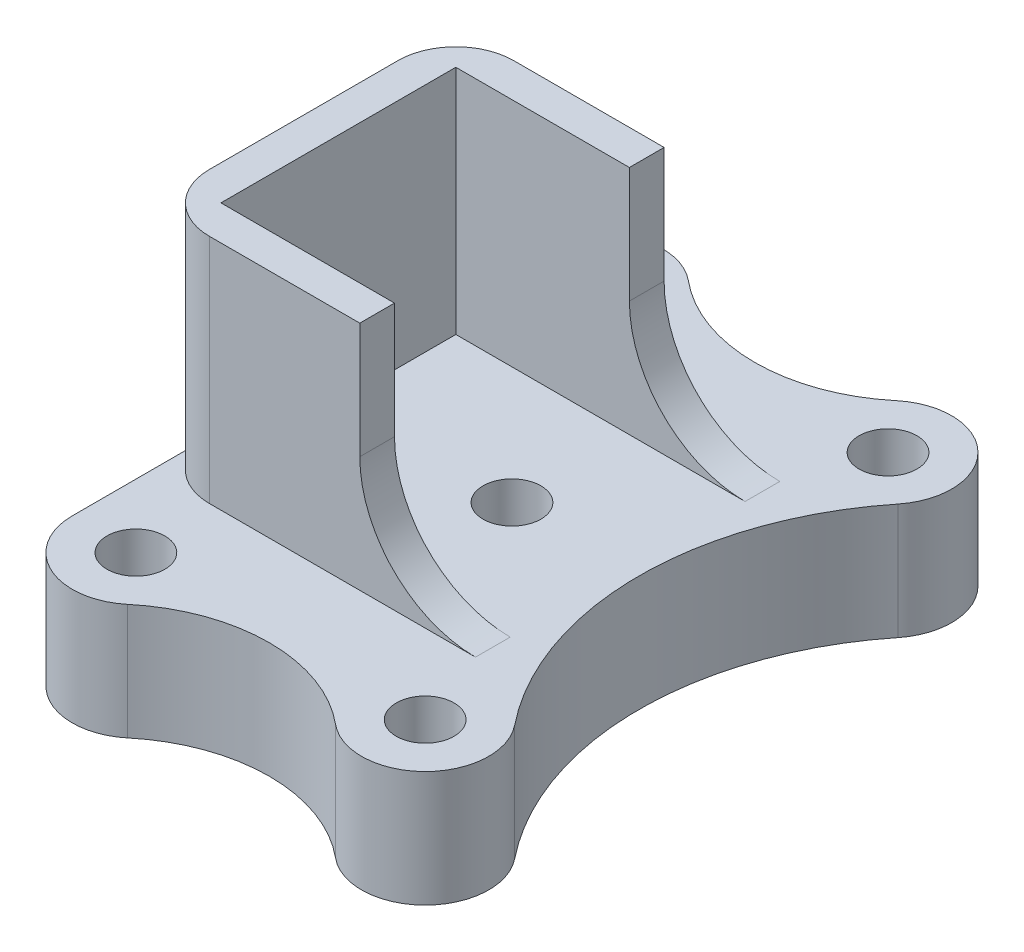
ISO-10303-21;
HEADER;
FILE_DESCRIPTION(('STEP AP214'),'2;1');
FILE_NAME('part.step','',(''),(''),'','','');
FILE_SCHEMA(('AUTOMOTIVE_DESIGN { 1 0 10303 214 1 1 1 1 }'));
ENDSEC;
DATA;
#1=APPLICATION_CONTEXT('core data for automotive mechanical design processes');
#2=APPLICATION_PROTOCOL_DEFINITION('international standard','automotive_design',2000,#1);
#3=PRODUCT_CONTEXT('',#1,'mechanical');
#4=PRODUCT('Part','Part','',(#3));
#5=PRODUCT_RELATED_PRODUCT_CATEGORY('part','',(#4));
#6=PRODUCT_DEFINITION_FORMATION('','',#4);
#7=PRODUCT_DEFINITION_CONTEXT('part definition',#1,'design');
#8=PRODUCT_DEFINITION('design','',#6,#7);
#9=PRODUCT_DEFINITION_SHAPE('','',#8);
#10=(LENGTH_UNIT() NAMED_UNIT(*) SI_UNIT(.MILLI.,.METRE.));
#11=(NAMED_UNIT(*) PLANE_ANGLE_UNIT() SI_UNIT($,.RADIAN.));
#12=(NAMED_UNIT(*) SI_UNIT($,.STERADIAN.) SOLID_ANGLE_UNIT());
#13=UNCERTAINTY_MEASURE_WITH_UNIT(LENGTH_MEASURE(1.E-05),#10,'distance_accuracy_value','');
#14=(GEOMETRIC_REPRESENTATION_CONTEXT(3) GLOBAL_UNCERTAINTY_ASSIGNED_CONTEXT((#13)) GLOBAL_UNIT_ASSIGNED_CONTEXT((#10,
#11,#12)) REPRESENTATION_CONTEXT('',''));
#15=CARTESIAN_POINT('',(0.,0.,0.));
#16=DIRECTION('',(0.,0.,1.));
#17=DIRECTION('',(1.,0.,0.));
#18=AXIS2_PLACEMENT_3D('',#15,#16,#17);
#19=CARTESIAN_POINT('',(-12.5,10.,20.));
#20=DIRECTION('',(0.,-1.,0.));
#21=DIRECTION('',(0.,0.,-1.));
#22=AXIS2_PLACEMENT_3D('',#19,#20,#21);
#23=PLANE('',#22);
#24=CARTESIAN_POINT('',(0.,10.,0.));
#25=DIRECTION('',(0.,1.,0.));
#26=DIRECTION('',(0.,0.,1.));
#27=AXIS2_PLACEMENT_3D('',#24,#25,#26);
#28=CIRCLE('',#27,2.5);
#29=CARTESIAN_POINT('',(0.,10.,2.49999999999999));
#30=VERTEX_POINT('',#29);
#31=EDGE_CURVE('E209',#30,#30,#28,.T.);
#32=ORIENTED_EDGE('',*,*,#31,.F.);
#33=EDGE_LOOP('',(#32));
#34=FACE_BOUND('',#33,.T.);
#35=CARTESIAN_POINT('',(-12.5,10.,20.));
#36=DIRECTION('',(0.,1.,0.));
#37=DIRECTION('',(0.,0.,-1.));
#38=AXIS2_PLACEMENT_3D('',#35,#36,#37);
#39=CIRCLE('',#38,2.49999999999997);
#40=CARTESIAN_POINT('',(-12.5,10.,17.5));
#41=VERTEX_POINT('',#40);
#42=EDGE_CURVE('E213',#41,#41,#39,.T.);
#43=ORIENTED_EDGE('',*,*,#42,.F.);
#44=EDGE_LOOP('',(#43));
#45=FACE_BOUND('',#44,.T.);
#46=CARTESIAN_POINT('',(12.5,10.,20.));
#47=DIRECTION('',(0.,1.,0.));
#48=DIRECTION('',(0.,0.,1.));
#49=AXIS2_PLACEMENT_3D('',#46,#47,#48);
#50=CIRCLE('',#49,2.50000000000004);
#51=CARTESIAN_POINT('',(12.5,10.,22.5));
#52=VERTEX_POINT('',#51);
#53=EDGE_CURVE('E219',#52,#52,#50,.T.);
#54=ORIENTED_EDGE('',*,*,#53,.F.);
#55=EDGE_LOOP('',(#54));
#56=FACE_BOUND('',#55,.T.);
#57=CARTESIAN_POINT('',(12.5,10.,-20.));
#58=DIRECTION('',(0.,1.,0.));
#59=DIRECTION('',(0.,0.,-1.));
#60=AXIS2_PLACEMENT_3D('',#57,#58,#59);
#61=CIRCLE('',#60,2.5);
#62=CARTESIAN_POINT('',(12.5,10.,-22.5));
#63=VERTEX_POINT('',#62);
#64=EDGE_CURVE('E225',#63,#63,#61,.T.);
#65=ORIENTED_EDGE('',*,*,#64,.F.);
#66=EDGE_LOOP('',(#65));
#67=FACE_BOUND('',#66,.T.);
#68=CARTESIAN_POINT('',(-12.5,10.,-20.));
#69=DIRECTION('',(0.,1.,0.));
#70=DIRECTION('',(0.,0.,1.));
#71=AXIS2_PLACEMENT_3D('',#68,#69,#70);
#72=CIRCLE('',#71,2.5);
#73=CARTESIAN_POINT('',(-12.5,10.,-17.5));
#74=VERTEX_POINT('',#73);
#75=EDGE_CURVE('E231',#74,#74,#72,.T.);
#76=ORIENTED_EDGE('',*,*,#75,.F.);
#77=EDGE_LOOP('',(#76));
#78=FACE_BOUND('',#77,.T.);
#79=DIRECTION('',(-1.,0.,0.));
#80=VECTOR('',#79,1.);
#81=CARTESIAN_POINT('',(0.,10.,-13.15));
#82=LINE('',#81,#80);
#83=CARTESIAN_POINT('',(10.,10.,-13.15));
#84=VERTEX_POINT('',#83);
#85=CARTESIAN_POINT('',(-13.,10.,-13.15));
#86=VERTEX_POINT('',#85);
#87=EDGE_CURVE('E354',#84,#86,#82,.T.);
#88=ORIENTED_EDGE('',*,*,#87,.F.);
#89=DIRECTION('',(0.,0.,-1.));
#90=VECTOR('',#89,1.);
#91=CARTESIAN_POINT('',(10.,10.,-10.15));
#92=LINE('',#91,#90);
#93=CARTESIAN_POINT('',(10.,10.,-10.15));
#94=VERTEX_POINT('',#93);
#95=EDGE_CURVE('E301',#84,#94,#92,.F.);
#96=ORIENTED_EDGE('',*,*,#95,.T.);
#97=DIRECTION('',(1.,0.,0.));
#98=VECTOR('',#97,1.);
#99=CARTESIAN_POINT('',(0.,10.,-10.15));
#100=LINE('',#99,#98);
#101=CARTESIAN_POINT('',(-15.,10.,-10.15));
#102=VERTEX_POINT('',#101);
#103=EDGE_CURVE('E189',#102,#94,#100,.T.);
#104=ORIENTED_EDGE('',*,*,#103,.F.);
#105=DIRECTION('',(0.,0.,-1.));
#106=VECTOR('',#105,1.);
#107=CARTESIAN_POINT('',(-15.,10.,-10.15));
#108=LINE('',#107,#106);
#109=CARTESIAN_POINT('',(-15.,10.,10.15));
#110=VERTEX_POINT('',#109);
#111=EDGE_CURVE('E360',#110,#102,#108,.T.);
#112=ORIENTED_EDGE('',*,*,#111,.F.);
#113=DIRECTION('',(-1.,0.,0.));
#114=VECTOR('',#113,1.);
#115=CARTESIAN_POINT('',(0.,10.,10.15));
#116=LINE('',#115,#114);
#117=CARTESIAN_POINT('',(10.,10.,10.15));
#118=VERTEX_POINT('',#117);
#119=EDGE_CURVE('E357',#118,#110,#116,.T.);
#120=ORIENTED_EDGE('',*,*,#119,.F.);
#121=DIRECTION('',(0.,0.,-1.));
#122=VECTOR('',#121,1.);
#123=CARTESIAN_POINT('',(10.,10.,13.15));
#124=LINE('',#123,#122);
#125=CARTESIAN_POINT('',(10.,10.,13.15));
#126=VERTEX_POINT('',#125);
#127=EDGE_CURVE('E298',#118,#126,#124,.F.);
#128=ORIENTED_EDGE('',*,*,#127,.T.);
#129=DIRECTION('',(1.,0.,0.));
#130=VECTOR('',#129,1.);
#131=CARTESIAN_POINT('',(0.,10.,13.15));
#132=LINE('',#131,#130);
#133=CARTESIAN_POINT('',(-13.,10.,13.15));
#134=VERTEX_POINT('',#133);
#135=EDGE_CURVE('E332',#134,#126,#132,.T.);
#136=ORIENTED_EDGE('',*,*,#135,.F.);
#137=CARTESIAN_POINT('',(-13.,10.,8.15));
#138=DIRECTION('',(0.,-1.,0.));
#139=DIRECTION('',(0.,0.,-1.));
#140=AXIS2_PLACEMENT_3D('',#137,#138,#139);
#141=CIRCLE('',#140,5.);
#142=CARTESIAN_POINT('',(-18.,10.,8.15));
#143=VERTEX_POINT('',#142);
#144=EDGE_CURVE('E45',#134,#143,#141,.T.);
#145=ORIENTED_EDGE('',*,*,#144,.T.);
#146=DIRECTION('',(0.,0.,1.));
#147=VECTOR('',#146,1.);
#148=CARTESIAN_POINT('',(-18.,10.,20.));
#149=LINE('',#148,#147);
#150=CARTESIAN_POINT('',(-18.,10.,20.));
#151=VERTEX_POINT('',#150);
#152=EDGE_CURVE('E253',#143,#151,#149,.T.);
#153=ORIENTED_EDGE('',*,*,#152,.T.);
#154=CARTESIAN_POINT('',(-12.5,10.,20.));
#155=DIRECTION('',(0.,1.,0.));
#156=DIRECTION('',(0.,0.,-1.));
#157=AXIS2_PLACEMENT_3D('',#154,#155,#156);
#158=CIRCLE('',#157,5.49999999999998);
#159=CARTESIAN_POINT('',(-8.97898580184539,10.,24.2252170377855));
#160=VERTEX_POINT('',#159);
#161=EDGE_CURVE('E237',#151,#160,#158,.T.);
#162=ORIENTED_EDGE('',*,*,#161,.T.);
#163=CARTESIAN_POINT('',(0.,10.,35.));
#164=DIRECTION('',(0.,-1.,0.));
#165=DIRECTION('',(0.,0.,-1.));
#166=AXIS2_PLACEMENT_3D('',#163,#164,#165);
#167=CIRCLE('',#166,14.0256241897666);
#168=CARTESIAN_POINT('',(8.97898580184533,10.,24.2252170377856));
#169=VERTEX_POINT('',#168);
#170=EDGE_CURVE('E240',#160,#169,#167,.T.);
#171=ORIENTED_EDGE('',*,*,#170,.T.);
#172=CARTESIAN_POINT('',(12.5,10.,20.));
#173=DIRECTION('',(0.,1.,0.));
#174=DIRECTION('',(0.,0.,1.));
#175=AXIS2_PLACEMENT_3D('',#172,#173,#174);
#176=CIRCLE('',#175,5.50000000000001);
#177=CARTESIAN_POINT('',(16.7947784519367,10.,16.5641772384507));
#178=VERTEX_POINT('',#177);
#179=EDGE_CURVE('E243',#169,#178,#176,.T.);
#180=ORIENTED_EDGE('',*,*,#179,.T.);
#181=CARTESIAN_POINT('',(37.5,10.,0.));
#182=DIRECTION('',(0.,-1.,0.));
#183=DIRECTION('',(0.,0.,1.));
#184=AXIS2_PLACEMENT_3D('',#181,#182,#183);
#185=CIRCLE('',#184,26.5156211871643);
#186=CARTESIAN_POINT('',(16.7947784519367,10.,-16.5641772384507));
#187=VERTEX_POINT('',#186);
#188=EDGE_CURVE('E245',#178,#187,#185,.T.);
#189=ORIENTED_EDGE('',*,*,#188,.T.);
#190=CARTESIAN_POINT('',(12.5,10.,-20.));
#191=DIRECTION('',(0.,1.,0.));
#192=DIRECTION('',(0.,0.,-1.));
#193=AXIS2_PLACEMENT_3D('',#190,#191,#192);
#194=CIRCLE('',#193,5.5);
#195=CARTESIAN_POINT('',(8.97898580184536,10.,-24.2252170377856));
#196=VERTEX_POINT('',#195);
#197=EDGE_CURVE('E247',#187,#196,#194,.T.);
#198=ORIENTED_EDGE('',*,*,#197,.T.);
#199=CARTESIAN_POINT('',(0.,10.,-35.));
#200=DIRECTION('',(0.,-1.,0.));
#201=DIRECTION('',(0.,0.,1.));
#202=AXIS2_PLACEMENT_3D('',#199,#200,#201);
#203=CIRCLE('',#202,14.0256241897666);
#204=CARTESIAN_POINT('',(-8.97898580184536,10.,-24.2252170377856));
#205=VERTEX_POINT('',#204);
#206=EDGE_CURVE('E249',#196,#205,#203,.T.);
#207=ORIENTED_EDGE('',*,*,#206,.T.);
#208=CARTESIAN_POINT('',(-12.5,10.,-20.));
#209=DIRECTION('',(0.,1.,0.));
#210=DIRECTION('',(0.,0.,1.));
#211=AXIS2_PLACEMENT_3D('',#208,#209,#210);
#212=CIRCLE('',#211,5.5);
#213=CARTESIAN_POINT('',(-18.,10.,-20.));
#214=VERTEX_POINT('',#213);
#215=EDGE_CURVE('E251',#205,#214,#212,.T.);
#216=ORIENTED_EDGE('',*,*,#215,.T.);
#217=CARTESIAN_POINT('',(-18.,10.,-8.15));
#218=VERTEX_POINT('',#217);
#219=EDGE_CURVE('E254',#214,#218,#149,.T.);
#220=ORIENTED_EDGE('',*,*,#219,.T.);
#221=CARTESIAN_POINT('',(-13.,10.,-8.15));
#222=DIRECTION('',(0.,-1.,0.));
#223=DIRECTION('',(0.,0.,-1.));
#224=AXIS2_PLACEMENT_3D('',#221,#222,#223);
#225=CIRCLE('',#224,5.);
#226=EDGE_CURVE('E11',#218,#86,#225,.T.);
#227=ORIENTED_EDGE('',*,*,#226,.T.);
#228=EDGE_LOOP('',(#88,#96,#104,#112,#120,#128,#136,#145,#153,#162,#171,#180,#189,#198,#207,
#216,#220,#227));
#229=FACE_BOUND('',#228,.T.);
#230=ADVANCED_FACE('F37',(#34,#45,#56,#67,#78,#229),#23,.F.);
#231=CARTESIAN_POINT('',(0.,10.,0.));
#232=DIRECTION('',(0.,-1.,0.));
#233=DIRECTION('',(0.,0.,-1.));
#234=AXIS2_PLACEMENT_3D('',#231,#232,#233);
#235=CYLINDRICAL_SURFACE('',#234,2.5);
#236=ORIENTED_EDGE('',*,*,#31,.T.);
#237=EDGE_LOOP('',(#236));
#238=FACE_BOUND('',#237,.T.);
#239=CARTESIAN_POINT('',(0.,4.,0.));
#240=DIRECTION('',(0.,-1.,0.));
#241=DIRECTION('',(0.,0.,-1.));
#242=AXIS2_PLACEMENT_3D('',#239,#240,#241);
#243=CIRCLE('',#242,2.5);
#244=CARTESIAN_POINT('',(0.,4.,-2.50000000000001));
#245=VERTEX_POINT('',#244);
#246=EDGE_CURVE('E207',#245,#245,#243,.T.);
#247=ORIENTED_EDGE('',*,*,#246,.T.);
#248=EDGE_LOOP('',(#247));
#249=FACE_BOUND('',#248,.T.);
#250=ADVANCED_FACE('F400',(#238,#249),#235,.F.);
#251=CARTESIAN_POINT('',(-12.5,0.,20.));
#252=DIRECTION('',(0.,-1.,0.));
#253=DIRECTION('',(0.,0.,-1.));
#254=AXIS2_PLACEMENT_3D('',#251,#252,#253);
#255=PLANE('',#254);
#256=CARTESIAN_POINT('',(0.,0.,0.));
#257=DIRECTION('',(0.,-1.,0.));
#258=DIRECTION('',(0.,0.,-1.));
#259=AXIS2_PLACEMENT_3D('',#256,#257,#258);
#260=CIRCLE('',#259,5.5);
#261=CARTESIAN_POINT('',(0.,0.,-5.50000000000001));
#262=VERTEX_POINT('',#261);
#263=EDGE_CURVE('E195',#262,#262,#260,.T.);
#264=ORIENTED_EDGE('',*,*,#263,.F.);
#265=EDGE_LOOP('',(#264));
#266=FACE_BOUND('',#265,.T.);
#267=CARTESIAN_POINT('',(-12.5,0.,20.));
#268=DIRECTION('',(0.,1.,0.));
#269=DIRECTION('',(0.,0.,-1.));
#270=AXIS2_PLACEMENT_3D('',#267,#268,#269);
#271=CIRCLE('',#270,2.49999999999997);
#272=CARTESIAN_POINT('',(-12.5,0.,17.5));
#273=VERTEX_POINT('',#272);
#274=EDGE_CURVE('E212',#273,#273,#271,.T.);
#275=ORIENTED_EDGE('',*,*,#274,.T.);
#276=EDGE_LOOP('',(#275));
#277=FACE_BOUND('',#276,.T.);
#278=CARTESIAN_POINT('',(12.5,0.,-20.));
#279=DIRECTION('',(0.,1.,0.));
#280=DIRECTION('',(0.,0.,-1.));
#281=AXIS2_PLACEMENT_3D('',#278,#279,#280);
#282=CIRCLE('',#281,2.5);
#283=CARTESIAN_POINT('',(12.5,0.,-22.5));
#284=VERTEX_POINT('',#283);
#285=EDGE_CURVE('E222',#284,#284,#282,.T.);
#286=ORIENTED_EDGE('',*,*,#285,.T.);
#287=EDGE_LOOP('',(#286));
#288=FACE_BOUND('',#287,.T.);
#289=CARTESIAN_POINT('',(-12.5,0.,20.));
#290=DIRECTION('',(0.,1.,0.));
#291=DIRECTION('',(0.,0.,-1.));
#292=AXIS2_PLACEMENT_3D('',#289,#290,#291);
#293=CIRCLE('',#292,5.49999999999998);
#294=CARTESIAN_POINT('',(-18.,0.,20.));
#295=VERTEX_POINT('',#294);
#296=CARTESIAN_POINT('',(-8.97898580184539,0.,24.2252170377855));
#297=VERTEX_POINT('',#296);
#298=EDGE_CURVE('E234',#295,#297,#293,.T.);
#299=ORIENTED_EDGE('',*,*,#298,.F.);
#300=DIRECTION('',(0.,0.,1.));
#301=VECTOR('',#300,1.);
#302=CARTESIAN_POINT('',(-18.,0.,20.));
#303=LINE('',#302,#301);
#304=CARTESIAN_POINT('',(-18.,0.,-20.));
#305=VERTEX_POINT('',#304);
#306=EDGE_CURVE('E241',#305,#295,#303,.T.);
#307=ORIENTED_EDGE('',*,*,#306,.F.);
#308=CARTESIAN_POINT('',(-12.5,0.,-20.));
#309=DIRECTION('',(0.,1.,0.));
#310=DIRECTION('',(0.,0.,1.));
#311=AXIS2_PLACEMENT_3D('',#308,#309,#310);
#312=CIRCLE('',#311,5.5);
#313=CARTESIAN_POINT('',(-8.97898580184536,0.,-24.2252170377856));
#314=VERTEX_POINT('',#313);
#315=EDGE_CURVE('E269',#314,#305,#312,.T.);
#316=ORIENTED_EDGE('',*,*,#315,.F.);
#317=CARTESIAN_POINT('',(0.,0.,-35.));
#318=DIRECTION('',(0.,-1.,0.));
#319=DIRECTION('',(0.,0.,1.));
#320=AXIS2_PLACEMENT_3D('',#317,#318,#319);
#321=CIRCLE('',#320,14.0256241897666);
#322=CARTESIAN_POINT('',(8.97898580184536,0.,-24.2252170377856));
#323=VERTEX_POINT('',#322);
#324=EDGE_CURVE('E267',#323,#314,#321,.T.);
#325=ORIENTED_EDGE('',*,*,#324,.F.);
#326=CARTESIAN_POINT('',(12.5,0.,-20.));
#327=DIRECTION('',(0.,1.,0.));
#328=DIRECTION('',(0.,0.,-1.));
#329=AXIS2_PLACEMENT_3D('',#326,#327,#328);
#330=CIRCLE('',#329,5.5);
#331=CARTESIAN_POINT('',(16.7947784519367,0.,-16.5641772384507));
#332=VERTEX_POINT('',#331);
#333=EDGE_CURVE('E265',#332,#323,#330,.T.);
#334=ORIENTED_EDGE('',*,*,#333,.F.);
#335=CARTESIAN_POINT('',(37.5,0.,0.));
#336=DIRECTION('',(0.,-1.,0.));
#337=DIRECTION('',(0.,0.,1.));
#338=AXIS2_PLACEMENT_3D('',#335,#336,#337);
#339=CIRCLE('',#338,26.5156211871643);
#340=CARTESIAN_POINT('',(16.7947784519367,0.,16.5641772384507));
#341=VERTEX_POINT('',#340);
#342=EDGE_CURVE('E263',#341,#332,#339,.T.);
#343=ORIENTED_EDGE('',*,*,#342,.F.);
#344=CARTESIAN_POINT('',(12.5,0.,20.));
#345=DIRECTION('',(0.,1.,0.));
#346=DIRECTION('',(0.,0.,1.));
#347=AXIS2_PLACEMENT_3D('',#344,#345,#346);
#348=CIRCLE('',#347,5.50000000000001);
#349=CARTESIAN_POINT('',(8.97898580184533,0.,24.2252170377856));
#350=VERTEX_POINT('',#349);
#351=EDGE_CURVE('E261',#350,#341,#348,.T.);
#352=ORIENTED_EDGE('',*,*,#351,.F.);
#353=CARTESIAN_POINT('',(0.,0.,35.));
#354=DIRECTION('',(0.,-1.,0.));
#355=DIRECTION('',(0.,0.,-1.));
#356=AXIS2_PLACEMENT_3D('',#353,#354,#355);
#357=CIRCLE('',#356,14.0256241897666);
#358=EDGE_CURVE('E259',#297,#350,#357,.T.);
#359=ORIENTED_EDGE('',*,*,#358,.F.);
#360=EDGE_LOOP('',(#299,#307,#316,#325,#334,#343,#352,#359));
#361=FACE_BOUND('',#360,.T.);
#362=CARTESIAN_POINT('',(-12.5,0.,-20.));
#363=DIRECTION('',(0.,1.,0.));
#364=DIRECTION('',(0.,0.,1.));
#365=AXIS2_PLACEMENT_3D('',#362,#363,#364);
#366=CIRCLE('',#365,2.5);
#367=CARTESIAN_POINT('',(-12.5,0.,-17.5));
#368=VERTEX_POINT('',#367);
#369=EDGE_CURVE('E228',#368,#368,#366,.T.);
#370=ORIENTED_EDGE('',*,*,#369,.T.);
#371=EDGE_LOOP('',(#370));
#372=FACE_BOUND('',#371,.T.);
#373=CARTESIAN_POINT('',(12.5,0.,20.));
#374=DIRECTION('',(0.,1.,0.));
#375=DIRECTION('',(0.,0.,1.));
#376=AXIS2_PLACEMENT_3D('',#373,#374,#375);
#377=CIRCLE('',#376,2.50000000000004);
#378=CARTESIAN_POINT('',(12.5,0.,22.5));
#379=VERTEX_POINT('',#378);
#380=EDGE_CURVE('E216',#379,#379,#377,.T.);
#381=ORIENTED_EDGE('',*,*,#380,.T.);
#382=EDGE_LOOP('',(#381));
#383=FACE_BOUND('',#382,.T.);
#384=ADVANCED_FACE('F406',(#266,#277,#288,#361,#372,#383),#255,.T.);
#385=CARTESIAN_POINT('',(-12.5,10.,20.));
#386=DIRECTION('',(0.,-1.,0.));
#387=DIRECTION('',(0.,0.,-1.));
#388=AXIS2_PLACEMENT_3D('',#385,#386,#387);
#389=CYLINDRICAL_SURFACE('',#388,5.49999999999998);
#390=ORIENTED_EDGE('',*,*,#298,.T.);
#391=DIRECTION('',(0.,-1.,0.));
#392=VECTOR('',#391,1.);
#393=CARTESIAN_POINT('',(-8.97898580184539,10.,24.2252170377855));
#394=LINE('',#393,#392);
#395=EDGE_CURVE('E292',#160,#297,#394,.T.);
#396=ORIENTED_EDGE('',*,*,#395,.F.);
#397=ORIENTED_EDGE('',*,*,#161,.F.);
#398=DIRECTION('',(0.,-1.,0.));
#399=VECTOR('',#398,1.);
#400=CARTESIAN_POINT('',(-18.,10.,20.));
#401=LINE('',#400,#399);
#402=EDGE_CURVE('E256',#151,#295,#401,.T.);
#403=ORIENTED_EDGE('',*,*,#402,.T.);
#404=EDGE_LOOP('',(#390,#396,#397,#403));
#405=FACE_BOUND('',#404,.T.);
#406=ADVANCED_FACE('F417',(#405),#389,.T.);
#407=CARTESIAN_POINT('',(0.,10.,35.));
#408=DIRECTION('',(0.,-1.,0.));
#409=DIRECTION('',(0.,0.,-1.));
#410=AXIS2_PLACEMENT_3D('',#407,#408,#409);
#411=CYLINDRICAL_SURFACE('',#410,14.0256241897666);
#412=ORIENTED_EDGE('',*,*,#358,.T.);
#413=DIRECTION('',(0.,-1.,0.));
#414=VECTOR('',#413,1.);
#415=CARTESIAN_POINT('',(8.97898580184533,10.,24.2252170377856));
#416=LINE('',#415,#414);
#417=EDGE_CURVE('E289',#169,#350,#416,.T.);
#418=ORIENTED_EDGE('',*,*,#417,.F.);
#419=ORIENTED_EDGE('',*,*,#170,.F.);
#420=ORIENTED_EDGE('',*,*,#395,.T.);
#421=EDGE_LOOP('',(#412,#418,#419,#420));
#422=FACE_BOUND('',#421,.T.);
#423=ADVANCED_FACE('F440',(#422),#411,.F.);
#424=CARTESIAN_POINT('',(12.5,10.,20.));
#425=DIRECTION('',(0.,-1.,0.));
#426=DIRECTION('',(0.,0.,-1.));
#427=AXIS2_PLACEMENT_3D('',#424,#425,#426);
#428=CYLINDRICAL_SURFACE('',#427,5.50000000000001);
#429=ORIENTED_EDGE('',*,*,#351,.T.);
#430=DIRECTION('',(0.,-1.,0.));
#431=VECTOR('',#430,1.);
#432=CARTESIAN_POINT('',(16.7947784519367,10.,16.5641772384507));
#433=LINE('',#432,#431);
#434=EDGE_CURVE('E286',#178,#341,#433,.T.);
#435=ORIENTED_EDGE('',*,*,#434,.F.);
#436=ORIENTED_EDGE('',*,*,#179,.F.);
#437=ORIENTED_EDGE('',*,*,#417,.T.);
#438=EDGE_LOOP('',(#429,#435,#436,#437));
#439=FACE_BOUND('',#438,.T.);
#440=ADVANCED_FACE('F436',(#439),#428,.T.);
#441=CARTESIAN_POINT('',(37.5,10.,0.));
#442=DIRECTION('',(0.,-1.,0.));
#443=DIRECTION('',(0.,0.,-1.));
#444=AXIS2_PLACEMENT_3D('',#441,#442,#443);
#445=CYLINDRICAL_SURFACE('',#444,26.5156211871643);
#446=ORIENTED_EDGE('',*,*,#342,.T.);
#447=DIRECTION('',(0.,-1.,0.));
#448=VECTOR('',#447,1.);
#449=CARTESIAN_POINT('',(16.7947784519367,10.,-16.5641772384507));
#450=LINE('',#449,#448);
#451=EDGE_CURVE('E283',#187,#332,#450,.T.);
#452=ORIENTED_EDGE('',*,*,#451,.F.);
#453=ORIENTED_EDGE('',*,*,#188,.F.);
#454=ORIENTED_EDGE('',*,*,#434,.T.);
#455=EDGE_LOOP('',(#446,#452,#453,#454));
#456=FACE_BOUND('',#455,.T.);
#457=ADVANCED_FACE('F432',(#456),#445,.F.);
#458=CARTESIAN_POINT('',(12.5,10.,-20.));
#459=DIRECTION('',(0.,-1.,0.));
#460=DIRECTION('',(0.,0.,-1.));
#461=AXIS2_PLACEMENT_3D('',#458,#459,#460);
#462=CYLINDRICAL_SURFACE('',#461,5.5);
#463=ORIENTED_EDGE('',*,*,#333,.T.);
#464=DIRECTION('',(0.,-1.,0.));
#465=VECTOR('',#464,1.);
#466=CARTESIAN_POINT('',(8.97898580184536,10.,-24.2252170377856));
#467=LINE('',#466,#465);
#468=EDGE_CURVE('E280',#196,#323,#467,.T.);
#469=ORIENTED_EDGE('',*,*,#468,.F.);
#470=ORIENTED_EDGE('',*,*,#197,.F.);
#471=ORIENTED_EDGE('',*,*,#451,.T.);
#472=EDGE_LOOP('',(#463,#469,#470,#471));
#473=FACE_BOUND('',#472,.T.);
#474=ADVANCED_FACE('F428',(#473),#462,.T.);
#475=CARTESIAN_POINT('',(0.,10.,-35.));
#476=DIRECTION('',(0.,-1.,0.));
#477=DIRECTION('',(0.,0.,-1.));
#478=AXIS2_PLACEMENT_3D('',#475,#476,#477);
#479=CYLINDRICAL_SURFACE('',#478,14.0256241897666);
#480=ORIENTED_EDGE('',*,*,#324,.T.);
#481=DIRECTION('',(0.,-1.,0.));
#482=VECTOR('',#481,1.);
#483=CARTESIAN_POINT('',(-8.97898580184536,10.,-24.2252170377856));
#484=LINE('',#483,#482);
#485=EDGE_CURVE('E277',#205,#314,#484,.T.);
#486=ORIENTED_EDGE('',*,*,#485,.F.);
#487=ORIENTED_EDGE('',*,*,#206,.F.);
#488=ORIENTED_EDGE('',*,*,#468,.T.);
#489=EDGE_LOOP('',(#480,#486,#487,#488));
#490=FACE_BOUND('',#489,.T.);
#491=ADVANCED_FACE('F424',(#490),#479,.F.);
#492=CARTESIAN_POINT('',(-12.5,10.,-20.));
#493=DIRECTION('',(0.,-1.,0.));
#494=DIRECTION('',(0.,0.,-1.));
#495=AXIS2_PLACEMENT_3D('',#492,#493,#494);
#496=CYLINDRICAL_SURFACE('',#495,5.5);
#497=ORIENTED_EDGE('',*,*,#315,.T.);
#498=DIRECTION('',(0.,-1.,0.));
#499=VECTOR('',#498,1.);
#500=CARTESIAN_POINT('',(-18.,10.,-20.));
#501=LINE('',#500,#499);
#502=EDGE_CURVE('E274',#214,#305,#501,.T.);
#503=ORIENTED_EDGE('',*,*,#502,.F.);
#504=ORIENTED_EDGE('',*,*,#215,.F.);
#505=ORIENTED_EDGE('',*,*,#485,.T.);
#506=EDGE_LOOP('',(#497,#503,#504,#505));
#507=FACE_BOUND('',#506,.T.);
#508=ADVANCED_FACE('F421',(#507),#496,.T.);
#509=CARTESIAN_POINT('',(-18.,10.,20.));
#510=DIRECTION('',(1.,0.,0.));
#511=DIRECTION('',(0.,0.,-1.));
#512=AXIS2_PLACEMENT_3D('',#509,#510,#511);
#513=PLANE('',#512);
#514=ORIENTED_EDGE('',*,*,#152,.F.);
#515=DIRECTION('',(0.,-1.,0.));
#516=VECTOR('',#515,1.);
#517=CARTESIAN_POINT('',(-18.,10.,8.15));
#518=LINE('',#517,#516);
#519=CARTESIAN_POINT('',(-18.,30.,8.15));
#520=VERTEX_POINT('',#519);
#521=EDGE_CURVE('E322',#143,#520,#518,.F.);
#522=ORIENTED_EDGE('',*,*,#521,.T.);
#523=DIRECTION('',(0.,0.,1.));
#524=VECTOR('',#523,1.);
#525=CARTESIAN_POINT('',(-18.,30.,-13.15));
#526=LINE('',#525,#524);
#527=CARTESIAN_POINT('',(-18.,30.,-8.15));
#528=VERTEX_POINT('',#527);
#529=EDGE_CURVE('E178',#528,#520,#526,.T.);
#530=ORIENTED_EDGE('',*,*,#529,.F.);
#531=DIRECTION('',(0.,-1.,0.));
#532=VECTOR('',#531,1.);
#533=CARTESIAN_POINT('',(-18.,10.,-8.15));
#534=LINE('',#533,#532);
#535=EDGE_CURVE('E319',#528,#218,#534,.T.);
#536=ORIENTED_EDGE('',*,*,#535,.T.);
#537=ORIENTED_EDGE('',*,*,#219,.F.);
#538=ORIENTED_EDGE('',*,*,#502,.T.);
#539=ORIENTED_EDGE('',*,*,#306,.T.);
#540=ORIENTED_EDGE('',*,*,#402,.F.);
#541=EDGE_LOOP('',(#514,#522,#530,#536,#537,#538,#539,#540));
#542=FACE_BOUND('',#541,.T.);
#543=ADVANCED_FACE('F339',(#542),#513,.F.);
#544=CARTESIAN_POINT('',(-12.5,10.,-20.));
#545=DIRECTION('',(0.,-1.,0.));
#546=DIRECTION('',(0.,0.,-1.));
#547=AXIS2_PLACEMENT_3D('',#544,#545,#546);
#548=CYLINDRICAL_SURFACE('',#547,2.5);
#549=ORIENTED_EDGE('',*,*,#75,.T.);
#550=EDGE_LOOP('',(#549));
#551=FACE_BOUND('',#550,.T.);
#552=ORIENTED_EDGE('',*,*,#369,.F.);
#553=EDGE_LOOP('',(#552));
#554=FACE_BOUND('',#553,.T.);
#555=ADVANCED_FACE('F413',(#551,#554),#548,.F.);
#556=CARTESIAN_POINT('',(12.5,10.,-20.));
#557=DIRECTION('',(0.,-1.,0.));
#558=DIRECTION('',(0.,0.,-1.));
#559=AXIS2_PLACEMENT_3D('',#556,#557,#558);
#560=CYLINDRICAL_SURFACE('',#559,2.5);
#561=ORIENTED_EDGE('',*,*,#64,.T.);
#562=EDGE_LOOP('',(#561));
#563=FACE_BOUND('',#562,.T.);
#564=ORIENTED_EDGE('',*,*,#285,.F.);
#565=EDGE_LOOP('',(#564));
#566=FACE_BOUND('',#565,.T.);
#567=ADVANCED_FACE('F490',(#563,#566),#560,.F.);
#568=CARTESIAN_POINT('',(12.5,10.,20.));
#569=DIRECTION('',(0.,-1.,0.));
#570=DIRECTION('',(0.,0.,-1.));
#571=AXIS2_PLACEMENT_3D('',#568,#569,#570);
#572=CYLINDRICAL_SURFACE('',#571,2.50000000000004);
#573=ORIENTED_EDGE('',*,*,#53,.T.);
#574=EDGE_LOOP('',(#573));
#575=FACE_BOUND('',#574,.T.);
#576=ORIENTED_EDGE('',*,*,#380,.F.);
#577=EDGE_LOOP('',(#576));
#578=FACE_BOUND('',#577,.T.);
#579=ADVANCED_FACE('F487',(#575,#578),#572,.F.);
#580=CARTESIAN_POINT('',(-12.5,10.,20.));
#581=DIRECTION('',(0.,-1.,0.));
#582=DIRECTION('',(0.,0.,-1.));
#583=AXIS2_PLACEMENT_3D('',#580,#581,#582);
#584=CYLINDRICAL_SURFACE('',#583,2.49999999999997);
#585=ORIENTED_EDGE('',*,*,#42,.T.);
#586=EDGE_LOOP('',(#585));
#587=FACE_BOUND('',#586,.T.);
#588=ORIENTED_EDGE('',*,*,#274,.F.);
#589=EDGE_LOOP('',(#588));
#590=FACE_BOUND('',#589,.T.);
#591=ADVANCED_FACE('F489',(#587,#590),#584,.F.);
#592=CARTESIAN_POINT('',(0.,4.,0.));
#593=DIRECTION('',(0.,-1.,0.));
#594=DIRECTION('',(0.,0.,-1.));
#595=AXIS2_PLACEMENT_3D('',#592,#593,#594);
#596=CYLINDRICAL_SURFACE('',#595,5.5);
#597=CARTESIAN_POINT('',(0.,4.,0.));
#598=DIRECTION('',(0.,-1.,0.));
#599=DIRECTION('',(0.,0.,-1.));
#600=AXIS2_PLACEMENT_3D('',#597,#598,#599);
#601=CIRCLE('',#600,5.5);
#602=CARTESIAN_POINT('',(0.,4.,-5.50000000000001));
#603=VERTEX_POINT('',#602);
#604=EDGE_CURVE('E199',#603,#603,#601,.T.);
#605=ORIENTED_EDGE('',*,*,#604,.F.);
#606=EDGE_LOOP('',(#605));
#607=FACE_BOUND('',#606,.T.);
#608=ORIENTED_EDGE('',*,*,#263,.T.);
#609=EDGE_LOOP('',(#608));
#610=FACE_BOUND('',#609,.T.);
#611=ADVANCED_FACE('F497',(#607,#610),#596,.F.);
#612=CARTESIAN_POINT('',(0.,4.,0.));
#613=DIRECTION('',(0.,-1.,0.));
#614=DIRECTION('',(0.,0.,-1.));
#615=AXIS2_PLACEMENT_3D('',#612,#613,#614);
#616=PLANE('',#615);
#617=ORIENTED_EDGE('',*,*,#246,.F.);
#618=EDGE_LOOP('',(#617));
#619=FACE_BOUND('',#618,.T.);
#620=ORIENTED_EDGE('',*,*,#604,.T.);
#621=EDGE_LOOP('',(#620));
#622=FACE_BOUND('',#621,.T.);
#623=ADVANCED_FACE('F504',(#619,#622),#616,.T.);
#624=CARTESIAN_POINT('',(0.,30.,-10.15));
#625=DIRECTION('',(-1.,0.,0.));
#626=DIRECTION('',(0.,0.,1.));
#627=AXIS2_PLACEMENT_3D('',#624,#625,#626);
#628=PLANE('',#627);
#629=DIRECTION('',(0.,-1.,0.));
#630=VECTOR('',#629,1.);
#631=CARTESIAN_POINT('',(0.,30.,-10.15));
#632=LINE('',#631,#630);
#633=CARTESIAN_POINT('',(0.,30.,-10.15));
#634=VERTEX_POINT('',#633);
#635=CARTESIAN_POINT('',(0.,20.,-10.15));
#636=VERTEX_POINT('',#635);
#637=EDGE_CURVE('E353',#634,#636,#632,.T.);
#638=ORIENTED_EDGE('',*,*,#637,.T.);
#639=DIRECTION('',(0.,0.,-1.));
#640=VECTOR('',#639,1.);
#641=CARTESIAN_POINT('',(0.,20.,-13.15));
#642=LINE('',#641,#640);
#643=CARTESIAN_POINT('',(0.,20.,-13.15));
#644=VERTEX_POINT('',#643);
#645=EDGE_CURVE('E194',#636,#644,#642,.T.);
#646=ORIENTED_EDGE('',*,*,#645,.T.);
#647=DIRECTION('',(0.,-1.,0.));
#648=VECTOR('',#647,1.);
#649=CARTESIAN_POINT('',(0.,30.,-13.15));
#650=LINE('',#649,#648);
#651=CARTESIAN_POINT('',(0.,30.,-13.15));
#652=VERTEX_POINT('',#651);
#653=EDGE_CURVE('E175',#652,#644,#650,.T.);
#654=ORIENTED_EDGE('',*,*,#653,.F.);
#655=DIRECTION('',(0.,0.,-1.));
#656=VECTOR('',#655,1.);
#657=CARTESIAN_POINT('',(0.,30.,-10.15));
#658=LINE('',#657,#656);
#659=EDGE_CURVE('E179',#634,#652,#658,.T.);
#660=ORIENTED_EDGE('',*,*,#659,.F.);
#661=EDGE_LOOP('',(#638,#646,#654,#660));
#662=FACE_BOUND('',#661,.T.);
#663=ADVANCED_FACE('F192',(#662),#628,.F.);
#664=CARTESIAN_POINT('',(0.,30.,-13.15));
#665=DIRECTION('',(0.,0.,1.));
#666=DIRECTION('',(1.,0.,0.));
#667=AXIS2_PLACEMENT_3D('',#664,#665,#666);
#668=PLANE('',#667);
#669=ORIENTED_EDGE('',*,*,#87,.T.);
#670=DIRECTION('',(0.,-1.,0.));
#671=VECTOR('',#670,1.);
#672=CARTESIAN_POINT('',(-13.,30.,-13.15));
#673=LINE('',#672,#671);
#674=CARTESIAN_POINT('',(-13.,30.,-13.15));
#675=VERTEX_POINT('',#674);
#676=EDGE_CURVE('E57',#86,#675,#673,.F.);
#677=ORIENTED_EDGE('',*,*,#676,.T.);
#678=DIRECTION('',(-1.,0.,0.));
#679=VECTOR('',#678,1.);
#680=CARTESIAN_POINT('',(0.,30.,-13.15));
#681=LINE('',#680,#679);
#682=EDGE_CURVE('E170',#652,#675,#681,.T.);
#683=ORIENTED_EDGE('',*,*,#682,.F.);
#684=ORIENTED_EDGE('',*,*,#653,.T.);
#685=CARTESIAN_POINT('',(10.,20.,-13.15));
#686=DIRECTION('',(0.,0.,1.));
#687=DIRECTION('',(1.,0.,0.));
#688=AXIS2_PLACEMENT_3D('',#685,#686,#687);
#689=CIRCLE('',#688,10.);
#690=EDGE_CURVE('E307',#644,#84,#689,.T.);
#691=ORIENTED_EDGE('',*,*,#690,.T.);
#692=EDGE_LOOP('',(#669,#677,#683,#684,#691));
#693=FACE_BOUND('',#692,.T.);
#694=ADVANCED_FACE('F172',(#693),#668,.F.);
#695=CARTESIAN_POINT('',(0.,30.,13.15));
#696=DIRECTION('',(0.,0.,-1.));
#697=DIRECTION('',(-1.,0.,0.));
#698=AXIS2_PLACEMENT_3D('',#695,#696,#697);
#699=PLANE('',#698);
#700=DIRECTION('',(1.,0.,0.));
#701=VECTOR('',#700,1.);
#702=CARTESIAN_POINT('',(0.,30.,13.15));
#703=LINE('',#702,#701);
#704=CARTESIAN_POINT('',(-13.,30.,13.15));
#705=VERTEX_POINT('',#704);
#706=CARTESIAN_POINT('',(0.,30.,13.15));
#707=VERTEX_POINT('',#706);
#708=EDGE_CURVE('E342',#705,#707,#703,.T.);
#709=ORIENTED_EDGE('',*,*,#708,.F.);
#710=DIRECTION('',(0.,-1.,0.));
#711=VECTOR('',#710,1.);
#712=CARTESIAN_POINT('',(-13.,30.,13.15));
#713=LINE('',#712,#711);
#714=EDGE_CURVE('E316',#705,#134,#713,.T.);
#715=ORIENTED_EDGE('',*,*,#714,.T.);
#716=ORIENTED_EDGE('',*,*,#135,.T.);
#717=CARTESIAN_POINT('',(10.,20.,13.15));
#718=DIRECTION('',(0.,0.,-1.));
#719=DIRECTION('',(-1.,0.,0.));
#720=AXIS2_PLACEMENT_3D('',#717,#718,#719);
#721=CIRCLE('',#720,10.);
#722=CARTESIAN_POINT('',(0.,20.,13.15));
#723=VERTEX_POINT('',#722);
#724=EDGE_CURVE('E314',#126,#723,#721,.T.);
#725=ORIENTED_EDGE('',*,*,#724,.T.);
#726=DIRECTION('',(0.,-1.,0.));
#727=VECTOR('',#726,1.);
#728=CARTESIAN_POINT('',(0.,30.,13.15));
#729=LINE('',#728,#727);
#730=EDGE_CURVE('E196',#707,#723,#729,.T.);
#731=ORIENTED_EDGE('',*,*,#730,.F.);
#732=EDGE_LOOP('',(#709,#715,#716,#725,#731));
#733=FACE_BOUND('',#732,.T.);
#734=ADVANCED_FACE('F390',(#733),#699,.F.);
#735=CARTESIAN_POINT('',(0.,30.,10.15));
#736=DIRECTION('',(-1.,0.,0.));
#737=DIRECTION('',(0.,0.,1.));
#738=AXIS2_PLACEMENT_3D('',#735,#736,#737);
#739=PLANE('',#738);
#740=ORIENTED_EDGE('',*,*,#730,.T.);
#741=DIRECTION('',(0.,0.,-1.));
#742=VECTOR('',#741,1.);
#743=CARTESIAN_POINT('',(0.,20.,10.15));
#744=LINE('',#743,#742);
#745=CARTESIAN_POINT('',(0.,20.,10.15));
#746=VERTEX_POINT('',#745);
#747=EDGE_CURVE('E304',#723,#746,#744,.T.);
#748=ORIENTED_EDGE('',*,*,#747,.T.);
#749=DIRECTION('',(0.,-1.,0.));
#750=VECTOR('',#749,1.);
#751=CARTESIAN_POINT('',(0.,30.,10.15));
#752=LINE('',#751,#750);
#753=CARTESIAN_POINT('',(0.,30.,10.15));
#754=VERTEX_POINT('',#753);
#755=EDGE_CURVE('E202',#754,#746,#752,.T.);
#756=ORIENTED_EDGE('',*,*,#755,.F.);
#757=DIRECTION('',(0.,0.,-1.));
#758=VECTOR('',#757,1.);
#759=CARTESIAN_POINT('',(0.,30.,10.15));
#760=LINE('',#759,#758);
#761=EDGE_CURVE('E344',#707,#754,#760,.T.);
#762=ORIENTED_EDGE('',*,*,#761,.F.);
#763=EDGE_LOOP('',(#740,#748,#756,#762));
#764=FACE_BOUND('',#763,.T.);
#765=ADVANCED_FACE('F379',(#764),#739,.F.);
#766=CARTESIAN_POINT('',(0.,30.,10.15));
#767=DIRECTION('',(0.,0.,1.));
#768=DIRECTION('',(1.,0.,0.));
#769=AXIS2_PLACEMENT_3D('',#766,#767,#768);
#770=PLANE('',#769);
#771=ORIENTED_EDGE('',*,*,#119,.T.);
#772=DIRECTION('',(0.,-1.,0.));
#773=VECTOR('',#772,1.);
#774=CARTESIAN_POINT('',(-15.,30.,10.15));
#775=LINE('',#774,#773);
#776=CARTESIAN_POINT('',(-15.,30.,10.15));
#777=VERTEX_POINT('',#776);
#778=EDGE_CURVE('E368',#777,#110,#775,.T.);
#779=ORIENTED_EDGE('',*,*,#778,.F.);
#780=DIRECTION('',(-1.,0.,0.));
#781=VECTOR('',#780,1.);
#782=CARTESIAN_POINT('',(0.,30.,10.15));
#783=LINE('',#782,#781);
#784=EDGE_CURVE('E348',#754,#777,#783,.T.);
#785=ORIENTED_EDGE('',*,*,#784,.F.);
#786=ORIENTED_EDGE('',*,*,#755,.T.);
#787=CARTESIAN_POINT('',(10.,20.,10.15));
#788=DIRECTION('',(0.,0.,1.));
#789=DIRECTION('',(1.,0.,0.));
#790=AXIS2_PLACEMENT_3D('',#787,#788,#789);
#791=CIRCLE('',#790,10.);
#792=EDGE_CURVE('E311',#746,#118,#791,.T.);
#793=ORIENTED_EDGE('',*,*,#792,.T.);
#794=EDGE_LOOP('',(#771,#779,#785,#786,#793));
#795=FACE_BOUND('',#794,.T.);
#796=ADVANCED_FACE('F374',(#795),#770,.F.);
#797=CARTESIAN_POINT('',(-15.,30.,-10.15));
#798=DIRECTION('',(-1.,0.,0.));
#799=DIRECTION('',(0.,0.,1.));
#800=AXIS2_PLACEMENT_3D('',#797,#798,#799);
#801=PLANE('',#800);
#802=ORIENTED_EDGE('',*,*,#111,.T.);
#803=DIRECTION('',(0.,-1.,0.));
#804=VECTOR('',#803,1.);
#805=CARTESIAN_POINT('',(-15.,30.,-10.15));
#806=LINE('',#805,#804);
#807=CARTESIAN_POINT('',(-15.,30.,-10.15));
#808=VERTEX_POINT('',#807);
#809=EDGE_CURVE('E365',#808,#102,#806,.T.);
#810=ORIENTED_EDGE('',*,*,#809,.F.);
#811=DIRECTION('',(0.,0.,-1.));
#812=VECTOR('',#811,1.);
#813=CARTESIAN_POINT('',(-15.,30.,10.15));
#814=LINE('',#813,#812);
#815=EDGE_CURVE('E350',#777,#808,#814,.T.);
#816=ORIENTED_EDGE('',*,*,#815,.F.);
#817=ORIENTED_EDGE('',*,*,#778,.T.);
#818=EDGE_LOOP('',(#802,#810,#816,#817));
#819=FACE_BOUND('',#818,.T.);
#820=ADVANCED_FACE('F387',(#819),#801,.F.);
#821=CARTESIAN_POINT('',(0.,30.,-10.15));
#822=DIRECTION('',(0.,0.,-1.));
#823=DIRECTION('',(-1.,0.,0.));
#824=AXIS2_PLACEMENT_3D('',#821,#822,#823);
#825=PLANE('',#824);
#826=ORIENTED_EDGE('',*,*,#103,.T.);
#827=CARTESIAN_POINT('',(10.,20.,-10.15));
#828=DIRECTION('',(0.,0.,-1.));
#829=DIRECTION('',(-1.,0.,0.));
#830=AXIS2_PLACEMENT_3D('',#827,#828,#829);
#831=CIRCLE('',#830,10.);
#832=EDGE_CURVE('E309',#94,#636,#831,.T.);
#833=ORIENTED_EDGE('',*,*,#832,.T.);
#834=ORIENTED_EDGE('',*,*,#637,.F.);
#835=DIRECTION('',(1.,0.,0.));
#836=VECTOR('',#835,1.);
#837=CARTESIAN_POINT('',(0.,30.,-10.15));
#838=LINE('',#837,#836);
#839=EDGE_CURVE('E185',#808,#634,#838,.T.);
#840=ORIENTED_EDGE('',*,*,#839,.F.);
#841=ORIENTED_EDGE('',*,*,#809,.T.);
#842=EDGE_LOOP('',(#826,#833,#834,#840,#841));
#843=FACE_BOUND('',#842,.T.);
#844=ADVANCED_FACE('F536',(#843),#825,.F.);
#845=CARTESIAN_POINT('',(0.,30.,0.));
#846=DIRECTION('',(0.,1.,0.));
#847=DIRECTION('',(0.,0.,1.));
#848=AXIS2_PLACEMENT_3D('',#845,#846,#847);
#849=PLANE('',#848);
#850=ORIENTED_EDGE('',*,*,#529,.T.);
#851=CARTESIAN_POINT('',(-13.,30.,8.15));
#852=DIRECTION('',(0.,1.,0.));
#853=DIRECTION('',(0.,0.,1.));
#854=AXIS2_PLACEMENT_3D('',#851,#852,#853);
#855=CIRCLE('',#854,5.);
#856=EDGE_CURVE('E326',#520,#705,#855,.T.);
#857=ORIENTED_EDGE('',*,*,#856,.T.);
#858=ORIENTED_EDGE('',*,*,#708,.T.);
#859=ORIENTED_EDGE('',*,*,#761,.T.);
#860=ORIENTED_EDGE('',*,*,#784,.T.);
#861=ORIENTED_EDGE('',*,*,#815,.T.);
#862=ORIENTED_EDGE('',*,*,#839,.T.);
#863=ORIENTED_EDGE('',*,*,#659,.T.);
#864=ORIENTED_EDGE('',*,*,#682,.T.);
#865=CARTESIAN_POINT('',(-13.,30.,-8.15));
#866=DIRECTION('',(0.,1.,0.));
#867=DIRECTION('',(0.,0.,1.));
#868=AXIS2_PLACEMENT_3D('',#865,#866,#867);
#869=CIRCLE('',#868,5.);
#870=EDGE_CURVE('E324',#675,#528,#869,.T.);
#871=ORIENTED_EDGE('',*,*,#870,.T.);
#872=EDGE_LOOP('',(#850,#857,#858,#859,#860,#861,#862,#863,#864,#871));
#873=FACE_BOUND('',#872,.T.);
#874=ADVANCED_FACE('F183',(#873),#849,.T.);
#875=CARTESIAN_POINT('',(10.,20.,-10.15));
#876=DIRECTION('',(0.,0.,1.));
#877=DIRECTION('',(1.,0.,0.));
#878=AXIS2_PLACEMENT_3D('',#875,#876,#877);
#879=CYLINDRICAL_SURFACE('',#878,10.);
#880=ORIENTED_EDGE('',*,*,#832,.F.);
#881=ORIENTED_EDGE('',*,*,#95,.F.);
#882=ORIENTED_EDGE('',*,*,#690,.F.);
#883=ORIENTED_EDGE('',*,*,#645,.F.);
#884=EDGE_LOOP('',(#880,#881,#882,#883));
#885=FACE_BOUND('',#884,.T.);
#886=ADVANCED_FACE('F448',(#885),#879,.F.);
#887=CARTESIAN_POINT('',(10.,20.,10.15));
#888=DIRECTION('',(0.,0.,1.));
#889=DIRECTION('',(1.,0.,0.));
#890=AXIS2_PLACEMENT_3D('',#887,#888,#889);
#891=CYLINDRICAL_SURFACE('',#890,10.);
#892=ORIENTED_EDGE('',*,*,#724,.F.);
#893=ORIENTED_EDGE('',*,*,#127,.F.);
#894=ORIENTED_EDGE('',*,*,#792,.F.);
#895=ORIENTED_EDGE('',*,*,#747,.F.);
#896=EDGE_LOOP('',(#892,#893,#894,#895));
#897=FACE_BOUND('',#896,.T.);
#898=ADVANCED_FACE('F384',(#897),#891,.F.);
#899=CARTESIAN_POINT('',(-13.,30.,8.15));
#900=DIRECTION('',(0.,-1.,0.));
#901=DIRECTION('',(0.,0.,-1.));
#902=AXIS2_PLACEMENT_3D('',#899,#900,#901);
#903=CYLINDRICAL_SURFACE('',#902,5.);
#904=ORIENTED_EDGE('',*,*,#856,.F.);
#905=ORIENTED_EDGE('',*,*,#521,.F.);
#906=ORIENTED_EDGE('',*,*,#144,.F.);
#907=ORIENTED_EDGE('',*,*,#714,.F.);
#908=EDGE_LOOP('',(#904,#905,#906,#907));
#909=FACE_BOUND('',#908,.T.);
#910=ADVANCED_FACE('F336',(#909),#903,.T.);
#911=CARTESIAN_POINT('',(-13.,10.,-8.15));
#912=DIRECTION('',(0.,-1.,0.));
#913=DIRECTION('',(0.,0.,-1.));
#914=AXIS2_PLACEMENT_3D('',#911,#912,#913);
#915=CYLINDRICAL_SURFACE('',#914,5.);
#916=ORIENTED_EDGE('',*,*,#870,.F.);
#917=ORIENTED_EDGE('',*,*,#676,.F.);
#918=ORIENTED_EDGE('',*,*,#226,.F.);
#919=ORIENTED_EDGE('',*,*,#535,.F.);
#920=EDGE_LOOP('',(#916,#917,#918,#919));
#921=FACE_BOUND('',#920,.T.);
#922=ADVANCED_FACE('F39',(#921),#915,.T.);
#923=CLOSED_SHELL('',(#230,#250,#384,#406,#423,#440,#457,#474,#491,#508,#543,#555,#567,#579,
#591,#611,#623,#663,#694,#734,#765,#796,#820,#844,#874,#886,#898,#910,#922));
#924=MANIFOLD_SOLID_BREP('B2',#923);
#925=ADVANCED_BREP_SHAPE_REPRESENTATION('',(#18,#924),#14);
#926=SHAPE_DEFINITION_REPRESENTATION(#9,#925);
ENDSEC;
END-ISO-10303-21;
